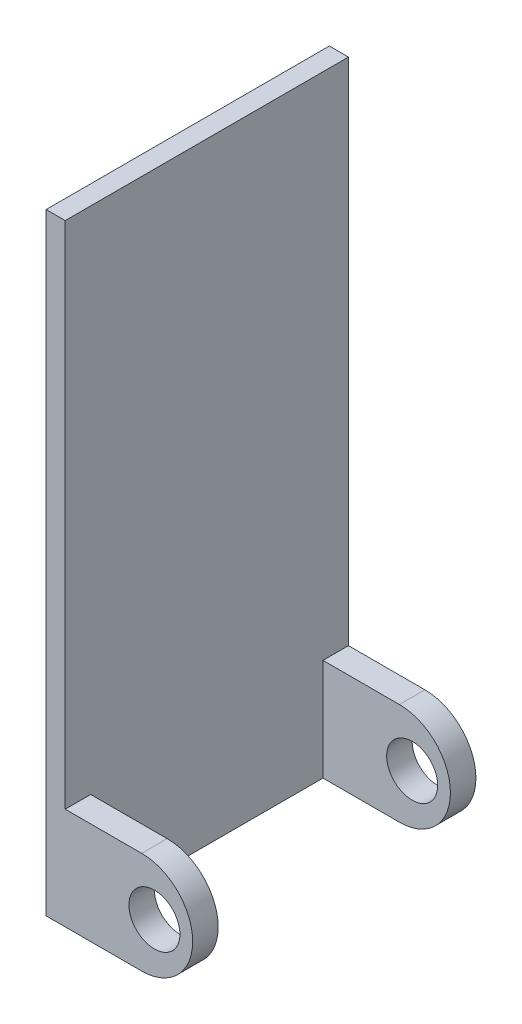
ISO-10303-21;
HEADER;
FILE_DESCRIPTION(('STEP AP214'),'2;1');
FILE_NAME('part.step','',(''),(''),'','','');
FILE_SCHEMA(('AUTOMOTIVE_DESIGN { 1 0 10303 214 1 1 1 1 }'));
ENDSEC;
DATA;
#1=APPLICATION_CONTEXT('core data for automotive mechanical design processes');
#2=APPLICATION_PROTOCOL_DEFINITION('international standard','automotive_design',2000,#1);
#3=PRODUCT_CONTEXT('',#1,'mechanical');
#4=PRODUCT('Part','Part','',(#3));
#5=PRODUCT_RELATED_PRODUCT_CATEGORY('part','',(#4));
#6=PRODUCT_DEFINITION_FORMATION('','',#4);
#7=PRODUCT_DEFINITION_CONTEXT('part definition',#1,'design');
#8=PRODUCT_DEFINITION('design','',#6,#7);
#9=PRODUCT_DEFINITION_SHAPE('','',#8);
#10=(LENGTH_UNIT() NAMED_UNIT(*) SI_UNIT(.MILLI.,.METRE.));
#11=(NAMED_UNIT(*) PLANE_ANGLE_UNIT() SI_UNIT($,.RADIAN.));
#12=(NAMED_UNIT(*) SI_UNIT($,.STERADIAN.) SOLID_ANGLE_UNIT());
#13=UNCERTAINTY_MEASURE_WITH_UNIT(LENGTH_MEASURE(1.E-05),#10,'distance_accuracy_value','');
#14=(GEOMETRIC_REPRESENTATION_CONTEXT(3) GLOBAL_UNCERTAINTY_ASSIGNED_CONTEXT((#13)) GLOBAL_UNIT_ASSIGNED_CONTEXT((#10,
#11,#12)) REPRESENTATION_CONTEXT('',''));
#15=CARTESIAN_POINT('',(0.,0.,0.));
#16=DIRECTION('',(0.,0.,1.));
#17=DIRECTION('',(1.,0.,0.));
#18=AXIS2_PLACEMENT_3D('',#15,#16,#17);
#19=CARTESIAN_POINT('',(13.5,-40.,4.));
#20=DIRECTION('',(0.,0.,-1.));
#21=DIRECTION('',(-1.,0.,0.));
#22=AXIS2_PLACEMENT_3D('',#19,#20,#21);
#23=CYLINDRICAL_SURFACE('',#22,8.);
#24=DIRECTION('',(0.,0.,1.));
#25=VECTOR('',#24,1.);
#26=CARTESIAN_POINT('',(13.5,-32.,4.));
#27=LINE('',#26,#25);
#28=CARTESIAN_POINT('',(13.5,-32.,4.));
#29=VERTEX_POINT('',#28);
#30=CARTESIAN_POINT('',(13.5,-32.,0.));
#31=VERTEX_POINT('',#30);
#32=EDGE_CURVE('E137',#29,#31,#27,.F.);
#33=ORIENTED_EDGE('',*,*,#32,.F.);
#34=CARTESIAN_POINT('',(13.5,-40.,4.));
#35=DIRECTION('',(0.,0.,-1.));
#36=DIRECTION('',(-1.,0.,0.));
#37=AXIS2_PLACEMENT_3D('',#34,#35,#36);
#38=CIRCLE('',#37,8.);
#39=CARTESIAN_POINT('',(13.5,-48.,4.));
#40=VERTEX_POINT('',#39);
#41=EDGE_CURVE('E47',#40,#29,#38,.F.);
#42=ORIENTED_EDGE('',*,*,#41,.F.);
#43=DIRECTION('',(0.,0.,-1.));
#44=VECTOR('',#43,1.);
#45=CARTESIAN_POINT('',(13.5,-48.,44.45));
#46=LINE('',#45,#44);
#47=CARTESIAN_POINT('',(13.5,-48.,0.));
#48=VERTEX_POINT('',#47);
#49=EDGE_CURVE('E205',#48,#40,#46,.F.);
#50=ORIENTED_EDGE('',*,*,#49,.F.);
#51=CARTESIAN_POINT('',(13.5,-40.,0.));
#52=DIRECTION('',(0.,0.,-1.));
#53=DIRECTION('',(-1.,0.,0.));
#54=AXIS2_PLACEMENT_3D('',#51,#52,#53);
#55=CIRCLE('',#54,8.);
#56=EDGE_CURVE('E11',#31,#48,#55,.T.);
#57=ORIENTED_EDGE('',*,*,#56,.F.);
#58=EDGE_LOOP('',(#33,#42,#50,#57));
#59=FACE_BOUND('',#58,.T.);
#60=ADVANCED_FACE('F39',(#59),#23,.T.);
#61=CARTESIAN_POINT('',(13.5,-40.,44.45));
#62=DIRECTION('',(0.,0.,1.));
#63=DIRECTION('',(1.,0.,0.));
#64=AXIS2_PLACEMENT_3D('',#61,#62,#63);
#65=CYLINDRICAL_SURFACE('',#64,8.);
#66=DIRECTION('',(0.,0.,-1.));
#67=VECTOR('',#66,1.);
#68=CARTESIAN_POINT('',(13.5,-32.,44.45));
#69=LINE('',#68,#67);
#70=CARTESIAN_POINT('',(13.5,-32.,44.45));
#71=VERTEX_POINT('',#70);
#72=CARTESIAN_POINT('',(13.5,-32.,40.45));
#73=VERTEX_POINT('',#72);
#74=EDGE_CURVE('E194',#71,#73,#69,.T.);
#75=ORIENTED_EDGE('',*,*,#74,.F.);
#76=CARTESIAN_POINT('',(13.5,-40.,44.45));
#77=DIRECTION('',(0.,0.,-1.));
#78=DIRECTION('',(-1.,0.,0.));
#79=AXIS2_PLACEMENT_3D('',#76,#77,#78);
#80=CIRCLE('',#79,8.);
#81=CARTESIAN_POINT('',(13.5,-48.,44.45));
#82=VERTEX_POINT('',#81);
#83=EDGE_CURVE('E200',#82,#71,#80,.F.);
#84=ORIENTED_EDGE('',*,*,#83,.F.);
#85=DIRECTION('',(0.,0.,-1.));
#86=VECTOR('',#85,1.);
#87=CARTESIAN_POINT('',(13.5,-48.,44.45));
#88=LINE('',#87,#86);
#89=CARTESIAN_POINT('',(13.5,-48.,40.45));
#90=VERTEX_POINT('',#89);
#91=EDGE_CURVE('E197',#90,#82,#88,.F.);
#92=ORIENTED_EDGE('',*,*,#91,.F.);
#93=CARTESIAN_POINT('',(13.5,-40.,40.45));
#94=DIRECTION('',(0.,0.,1.));
#95=DIRECTION('',(1.,0.,0.));
#96=AXIS2_PLACEMENT_3D('',#93,#94,#95);
#97=CIRCLE('',#96,8.);
#98=EDGE_CURVE('E202',#73,#90,#97,.F.);
#99=ORIENTED_EDGE('',*,*,#98,.F.);
#100=EDGE_LOOP('',(#75,#84,#92,#99));
#101=FACE_BOUND('',#100,.T.);
#102=ADVANCED_FACE('F236',(#101),#65,.T.);
#103=CARTESIAN_POINT('',(1.49999999999999,48.,44.45));
#104=DIRECTION('',(-1.,0.,0.));
#105=DIRECTION('',(0.,-1.,0.));
#106=AXIS2_PLACEMENT_3D('',#103,#104,#105);
#107=PLANE('',#106);
#108=DIRECTION('',(0.,1.,0.));
#109=VECTOR('',#108,1.);
#110=CARTESIAN_POINT('',(1.5,0.,4.));
#111=LINE('',#110,#109);
#112=CARTESIAN_POINT('',(1.50000000000001,-48.,4.));
#113=VERTEX_POINT('',#112);
#114=CARTESIAN_POINT('',(1.5,-32.,4.));
#115=VERTEX_POINT('',#114);
#116=EDGE_CURVE('E128',#113,#115,#111,.T.);
#117=ORIENTED_EDGE('',*,*,#116,.T.);
#118=DIRECTION('',(0.,0.,-1.));
#119=VECTOR('',#118,1.);
#120=CARTESIAN_POINT('',(1.5,-32.,4.));
#121=LINE('',#120,#119);
#122=CARTESIAN_POINT('',(1.5,-32.,0.));
#123=VERTEX_POINT('',#122);
#124=EDGE_CURVE('E125',#115,#123,#121,.T.);
#125=ORIENTED_EDGE('',*,*,#124,.T.);
#126=DIRECTION('',(0.,1.,0.));
#127=VECTOR('',#126,1.);
#128=CARTESIAN_POINT('',(1.49999999999999,48.,0.));
#129=LINE('',#128,#127);
#130=CARTESIAN_POINT('',(1.49999999999999,48.,0.));
#131=VERTEX_POINT('',#130);
#132=EDGE_CURVE('E111',#123,#131,#129,.T.);
#133=ORIENTED_EDGE('',*,*,#132,.T.);
#134=DIRECTION('',(0.,0.,-1.));
#135=VECTOR('',#134,1.);
#136=CARTESIAN_POINT('',(1.49999999999999,48.,44.45));
#137=LINE('',#136,#135);
#138=CARTESIAN_POINT('',(1.49999999999999,48.,44.45));
#139=VERTEX_POINT('',#138);
#140=EDGE_CURVE('E187',#139,#131,#137,.T.);
#141=ORIENTED_EDGE('',*,*,#140,.F.);
#142=DIRECTION('',(0.,1.,0.));
#143=VECTOR('',#142,1.);
#144=CARTESIAN_POINT('',(1.49999999999999,48.,44.45));
#145=LINE('',#144,#143);
#146=CARTESIAN_POINT('',(1.5,-32.,44.45));
#147=VERTEX_POINT('',#146);
#148=EDGE_CURVE('E175',#147,#139,#145,.T.);
#149=ORIENTED_EDGE('',*,*,#148,.F.);
#150=DIRECTION('',(0.,0.,1.));
#151=VECTOR('',#150,1.);
#152=CARTESIAN_POINT('',(1.5,-32.,40.45));
#153=LINE('',#152,#151);
#154=CARTESIAN_POINT('',(1.5,-32.,40.45));
#155=VERTEX_POINT('',#154);
#156=EDGE_CURVE('E161',#155,#147,#153,.T.);
#157=ORIENTED_EDGE('',*,*,#156,.F.);
#158=DIRECTION('',(0.,1.,0.));
#159=VECTOR('',#158,1.);
#160=CARTESIAN_POINT('',(1.5,0.,40.45));
#161=LINE('',#160,#159);
#162=CARTESIAN_POINT('',(1.50000000000001,-48.,40.45));
#163=VERTEX_POINT('',#162);
#164=EDGE_CURVE('E158',#163,#155,#161,.T.);
#165=ORIENTED_EDGE('',*,*,#164,.F.);
#166=DIRECTION('',(0.,0.,-1.));
#167=VECTOR('',#166,1.);
#168=CARTESIAN_POINT('',(1.50000000000001,-48.,44.45));
#169=LINE('',#168,#167);
#170=EDGE_CURVE('E189',#163,#113,#169,.T.);
#171=ORIENTED_EDGE('',*,*,#170,.T.);
#172=EDGE_LOOP('',(#117,#125,#133,#141,#149,#157,#165,#171));
#173=FACE_BOUND('',#172,.T.);
#174=ADVANCED_FACE('F126',(#173),#107,.F.);
#175=CARTESIAN_POINT('',(-1.50000000000001,48.,44.45));
#176=DIRECTION('',(1.,0.,0.));
#177=DIRECTION('',(0.,1.,0.));
#178=AXIS2_PLACEMENT_3D('',#175,#176,#177);
#179=PLANE('',#178);
#180=DIRECTION('',(0.,-1.,0.));
#181=VECTOR('',#180,1.);
#182=CARTESIAN_POINT('',(-1.50000000000001,48.,0.));
#183=LINE('',#182,#181);
#184=CARTESIAN_POINT('',(-1.50000000000001,48.,0.));
#185=VERTEX_POINT('',#184);
#186=CARTESIAN_POINT('',(-1.49999999999999,-48.,0.));
#187=VERTEX_POINT('',#186);
#188=EDGE_CURVE('E168',#185,#187,#183,.T.);
#189=ORIENTED_EDGE('',*,*,#188,.T.);
#190=DIRECTION('',(0.,0.,-1.));
#191=VECTOR('',#190,1.);
#192=CARTESIAN_POINT('',(-1.49999999999999,-48.,44.45));
#193=LINE('',#192,#191);
#194=CARTESIAN_POINT('',(-1.49999999999999,-48.,44.45));
#195=VERTEX_POINT('',#194);
#196=EDGE_CURVE('E191',#195,#187,#193,.T.);
#197=ORIENTED_EDGE('',*,*,#196,.F.);
#198=DIRECTION('',(0.,-1.,0.));
#199=VECTOR('',#198,1.);
#200=CARTESIAN_POINT('',(-1.50000000000001,48.,44.45));
#201=LINE('',#200,#199);
#202=CARTESIAN_POINT('',(-1.50000000000001,48.,44.45));
#203=VERTEX_POINT('',#202);
#204=EDGE_CURVE('E169',#203,#195,#201,.T.);
#205=ORIENTED_EDGE('',*,*,#204,.F.);
#206=DIRECTION('',(0.,0.,-1.));
#207=VECTOR('',#206,1.);
#208=CARTESIAN_POINT('',(-1.50000000000001,48.,44.45));
#209=LINE('',#208,#207);
#210=EDGE_CURVE('E179',#203,#185,#209,.T.);
#211=ORIENTED_EDGE('',*,*,#210,.T.);
#212=EDGE_LOOP('',(#189,#197,#205,#211));
#213=FACE_BOUND('',#212,.T.);
#214=ADVANCED_FACE('F216',(#213),#179,.F.);
#215=CARTESIAN_POINT('',(1.50000000000001,-48.,44.45));
#216=DIRECTION('',(0.,1.,0.));
#217=DIRECTION('',(0.,0.,1.));
#218=AXIS2_PLACEMENT_3D('',#215,#216,#217);
#219=PLANE('',#218);
#220=DIRECTION('',(1.,0.,0.));
#221=VECTOR('',#220,1.);
#222=CARTESIAN_POINT('',(1.50000000000001,-48.,0.));
#223=LINE('',#222,#221);
#224=EDGE_CURVE('E122',#187,#48,#223,.T.);
#225=ORIENTED_EDGE('',*,*,#224,.T.);
#226=ORIENTED_EDGE('',*,*,#49,.T.);
#227=DIRECTION('',(1.,0.,0.));
#228=VECTOR('',#227,1.);
#229=CARTESIAN_POINT('',(0.,-48.,4.));
#230=LINE('',#229,#228);
#231=EDGE_CURVE('E142',#113,#40,#230,.T.);
#232=ORIENTED_EDGE('',*,*,#231,.F.);
#233=ORIENTED_EDGE('',*,*,#170,.F.);
#234=DIRECTION('',(1.,0.,0.));
#235=VECTOR('',#234,1.);
#236=CARTESIAN_POINT('',(0.,-48.,40.45));
#237=LINE('',#236,#235);
#238=EDGE_CURVE('E151',#163,#90,#237,.T.);
#239=ORIENTED_EDGE('',*,*,#238,.T.);
#240=ORIENTED_EDGE('',*,*,#91,.T.);
#241=DIRECTION('',(1.,0.,0.));
#242=VECTOR('',#241,1.);
#243=CARTESIAN_POINT('',(1.50000000000001,-48.,44.45));
#244=LINE('',#243,#242);
#245=EDGE_CURVE('E172',#195,#82,#244,.T.);
#246=ORIENTED_EDGE('',*,*,#245,.F.);
#247=ORIENTED_EDGE('',*,*,#196,.T.);
#248=EDGE_LOOP('',(#225,#226,#232,#233,#239,#240,#246,#247));
#249=FACE_BOUND('',#248,.T.);
#250=ADVANCED_FACE('F213',(#249),#219,.F.);
#251=CARTESIAN_POINT('',(1.49999999999999,48.,44.45));
#252=DIRECTION('',(0.,-1.,0.));
#253=DIRECTION('',(0.,0.,-1.));
#254=AXIS2_PLACEMENT_3D('',#251,#252,#253);
#255=PLANE('',#254);
#256=DIRECTION('',(-1.,0.,0.));
#257=VECTOR('',#256,1.);
#258=CARTESIAN_POINT('',(1.49999999999999,48.,0.));
#259=LINE('',#258,#257);
#260=EDGE_CURVE('E118',#131,#185,#259,.T.);
#261=ORIENTED_EDGE('',*,*,#260,.T.);
#262=ORIENTED_EDGE('',*,*,#210,.F.);
#263=DIRECTION('',(-1.,0.,0.));
#264=VECTOR('',#263,1.);
#265=CARTESIAN_POINT('',(1.49999999999999,48.,44.45));
#266=LINE('',#265,#264);
#267=EDGE_CURVE('E177',#139,#203,#266,.T.);
#268=ORIENTED_EDGE('',*,*,#267,.F.);
#269=ORIENTED_EDGE('',*,*,#140,.T.);
#270=EDGE_LOOP('',(#261,#262,#268,#269));
#271=FACE_BOUND('',#270,.T.);
#272=ADVANCED_FACE('F221',(#271),#255,.F.);
#273=CARTESIAN_POINT('',(0.,0.,44.45));
#274=DIRECTION('',(0.,0.,-1.));
#275=DIRECTION('',(-1.,0.,0.));
#276=AXIS2_PLACEMENT_3D('',#273,#274,#275);
#277=PLANE('',#276);
#278=ORIENTED_EDGE('',*,*,#245,.T.);
#279=ORIENTED_EDGE('',*,*,#83,.T.);
#280=DIRECTION('',(1.,0.,0.));
#281=VECTOR('',#280,1.);
#282=CARTESIAN_POINT('',(0.,-32.,44.45));
#283=LINE('',#282,#281);
#284=EDGE_CURVE('E152',#147,#71,#283,.T.);
#285=ORIENTED_EDGE('',*,*,#284,.F.);
#286=ORIENTED_EDGE('',*,*,#148,.T.);
#287=ORIENTED_EDGE('',*,*,#267,.T.);
#288=ORIENTED_EDGE('',*,*,#204,.T.);
#289=EDGE_LOOP('',(#278,#279,#285,#286,#287,#288));
#290=FACE_BOUND('',#289,.T.);
#291=CARTESIAN_POINT('',(15.5,-40.,44.45));
#292=DIRECTION('',(0.,0.,1.));
#293=DIRECTION('',(1.,0.,0.));
#294=AXIS2_PLACEMENT_3D('',#291,#292,#293);
#295=CIRCLE('',#294,4.);
#296=CARTESIAN_POINT('',(19.5,-40.,44.45));
#297=VERTEX_POINT('',#296);
#298=EDGE_CURVE('E132',#297,#297,#295,.T.);
#299=ORIENTED_EDGE('',*,*,#298,.F.);
#300=EDGE_LOOP('',(#299));
#301=FACE_BOUND('',#300,.T.);
#302=ADVANCED_FACE('F225',(#290,#301),#277,.F.);
#303=CARTESIAN_POINT('',(0.,0.,0.));
#304=DIRECTION('',(0.,0.,-1.));
#305=DIRECTION('',(-1.,0.,0.));
#306=AXIS2_PLACEMENT_3D('',#303,#304,#305);
#307=PLANE('',#306);
#308=DIRECTION('',(1.,0.,0.));
#309=VECTOR('',#308,1.);
#310=CARTESIAN_POINT('',(0.,-32.,0.));
#311=LINE('',#310,#309);
#312=EDGE_CURVE('E116',#123,#31,#311,.T.);
#313=ORIENTED_EDGE('',*,*,#312,.T.);
#314=ORIENTED_EDGE('',*,*,#56,.T.);
#315=ORIENTED_EDGE('',*,*,#224,.F.);
#316=ORIENTED_EDGE('',*,*,#188,.F.);
#317=ORIENTED_EDGE('',*,*,#260,.F.);
#318=ORIENTED_EDGE('',*,*,#132,.F.);
#319=EDGE_LOOP('',(#313,#314,#315,#316,#317,#318));
#320=FACE_BOUND('',#319,.T.);
#321=CARTESIAN_POINT('',(15.5,-40.,0.));
#322=DIRECTION('',(0.,0.,1.));
#323=DIRECTION('',(1.,0.,0.));
#324=AXIS2_PLACEMENT_3D('',#321,#322,#323);
#325=CIRCLE('',#324,4.);
#326=CARTESIAN_POINT('',(19.5,-40.,0.));
#327=VERTEX_POINT('',#326);
#328=EDGE_CURVE('E139',#327,#327,#325,.T.);
#329=ORIENTED_EDGE('',*,*,#328,.T.);
#330=EDGE_LOOP('',(#329));
#331=FACE_BOUND('',#330,.T.);
#332=ADVANCED_FACE('F113',(#320,#331),#307,.T.);
#333=CARTESIAN_POINT('',(0.,-32.,40.45));
#334=DIRECTION('',(0.,-1.,0.));
#335=DIRECTION('',(0.,0.,-1.));
#336=AXIS2_PLACEMENT_3D('',#333,#334,#335);
#337=PLANE('',#336);
#338=ORIENTED_EDGE('',*,*,#284,.T.);
#339=ORIENTED_EDGE('',*,*,#74,.T.);
#340=DIRECTION('',(1.,0.,0.));
#341=VECTOR('',#340,1.);
#342=CARTESIAN_POINT('',(0.,-32.,40.45));
#343=LINE('',#342,#341);
#344=EDGE_CURVE('E155',#155,#73,#343,.T.);
#345=ORIENTED_EDGE('',*,*,#344,.F.);
#346=ORIENTED_EDGE('',*,*,#156,.T.);
#347=EDGE_LOOP('',(#338,#339,#345,#346));
#348=FACE_BOUND('',#347,.T.);
#349=ADVANCED_FACE('F229',(#348),#337,.F.);
#350=CARTESIAN_POINT('',(15.5,-40.,40.45));
#351=DIRECTION('',(0.,0.,1.));
#352=DIRECTION('',(1.,0.,0.));
#353=AXIS2_PLACEMENT_3D('',#350,#351,#352);
#354=CYLINDRICAL_SURFACE('',#353,4.);
#355=CARTESIAN_POINT('',(15.5,-40.,40.45));
#356=DIRECTION('',(0.,0.,1.));
#357=DIRECTION('',(1.,0.,0.));
#358=AXIS2_PLACEMENT_3D('',#355,#356,#357);
#359=CIRCLE('',#358,4.);
#360=CARTESIAN_POINT('',(19.5,-40.,40.45));
#361=VERTEX_POINT('',#360);
#362=EDGE_CURVE('E148',#361,#361,#359,.T.);
#363=ORIENTED_EDGE('',*,*,#362,.F.);
#364=EDGE_LOOP('',(#363));
#365=FACE_BOUND('',#364,.T.);
#366=ORIENTED_EDGE('',*,*,#298,.T.);
#367=EDGE_LOOP('',(#366));
#368=FACE_BOUND('',#367,.T.);
#369=ADVANCED_FACE('F257',(#365,#368),#354,.F.);
#370=CARTESIAN_POINT('',(0.,0.,40.45));
#371=DIRECTION('',(0.,0.,1.));
#372=DIRECTION('',(1.,0.,0.));
#373=AXIS2_PLACEMENT_3D('',#370,#371,#372);
#374=PLANE('',#373);
#375=ORIENTED_EDGE('',*,*,#362,.T.);
#376=EDGE_LOOP('',(#375));
#377=FACE_BOUND('',#376,.T.);
#378=ORIENTED_EDGE('',*,*,#344,.T.);
#379=ORIENTED_EDGE('',*,*,#98,.T.);
#380=ORIENTED_EDGE('',*,*,#238,.F.);
#381=ORIENTED_EDGE('',*,*,#164,.T.);
#382=EDGE_LOOP('',(#378,#379,#380,#381));
#383=FACE_BOUND('',#382,.T.);
#384=ADVANCED_FACE('F232',(#377,#383),#374,.F.);
#385=CARTESIAN_POINT('',(0.,-32.,4.));
#386=DIRECTION('',(0.,1.,0.));
#387=DIRECTION('',(0.,0.,1.));
#388=AXIS2_PLACEMENT_3D('',#385,#386,#387);
#389=PLANE('',#388);
#390=DIRECTION('',(1.,0.,0.));
#391=VECTOR('',#390,1.);
#392=CARTESIAN_POINT('',(0.,-32.,4.));
#393=LINE('',#392,#391);
#394=EDGE_CURVE('E133',#115,#29,#393,.T.);
#395=ORIENTED_EDGE('',*,*,#394,.T.);
#396=ORIENTED_EDGE('',*,*,#32,.T.);
#397=ORIENTED_EDGE('',*,*,#312,.F.);
#398=ORIENTED_EDGE('',*,*,#124,.F.);
#399=EDGE_LOOP('',(#395,#396,#397,#398));
#400=FACE_BOUND('',#399,.T.);
#401=ADVANCED_FACE('F136',(#400),#389,.T.);
#402=CARTESIAN_POINT('',(15.5,-40.,4.));
#403=DIRECTION('',(0.,0.,-1.));
#404=DIRECTION('',(-1.,0.,0.));
#405=AXIS2_PLACEMENT_3D('',#402,#403,#404);
#406=CYLINDRICAL_SURFACE('',#405,4.);
#407=CARTESIAN_POINT('',(15.5,-40.,4.));
#408=DIRECTION('',(0.,0.,1.));
#409=DIRECTION('',(1.,0.,0.));
#410=AXIS2_PLACEMENT_3D('',#407,#408,#409);
#411=CIRCLE('',#410,4.);
#412=CARTESIAN_POINT('',(19.5,-40.,4.));
#413=VERTEX_POINT('',#412);
#414=EDGE_CURVE('E138',#413,#413,#411,.T.);
#415=ORIENTED_EDGE('',*,*,#414,.T.);
#416=EDGE_LOOP('',(#415));
#417=FACE_BOUND('',#416,.T.);
#418=ORIENTED_EDGE('',*,*,#328,.F.);
#419=EDGE_LOOP('',(#418));
#420=FACE_BOUND('',#419,.T.);
#421=ADVANCED_FACE('F266',(#417,#420),#406,.F.);
#422=CARTESIAN_POINT('',(0.,0.,4.));
#423=DIRECTION('',(0.,0.,-1.));
#424=DIRECTION('',(1.,0.,0.));
#425=AXIS2_PLACEMENT_3D('',#422,#423,#424);
#426=PLANE('',#425);
#427=ORIENTED_EDGE('',*,*,#414,.F.);
#428=EDGE_LOOP('',(#427));
#429=FACE_BOUND('',#428,.T.);
#430=ORIENTED_EDGE('',*,*,#231,.T.);
#431=ORIENTED_EDGE('',*,*,#41,.T.);
#432=ORIENTED_EDGE('',*,*,#394,.F.);
#433=ORIENTED_EDGE('',*,*,#116,.F.);
#434=EDGE_LOOP('',(#430,#431,#432,#433));
#435=FACE_BOUND('',#434,.T.);
#436=ADVANCED_FACE('F208',(#429,#435),#426,.F.);
#437=CLOSED_SHELL('',(#60,#102,#174,#214,#250,#272,#302,#332,#349,#369,#384,#401,#421,#436));
#438=MANIFOLD_SOLID_BREP('B2',#437);
#439=ADVANCED_BREP_SHAPE_REPRESENTATION('',(#18,#438),#14);
#440=SHAPE_DEFINITION_REPRESENTATION(#9,#439);
ENDSEC;
END-ISO-10303-21;
